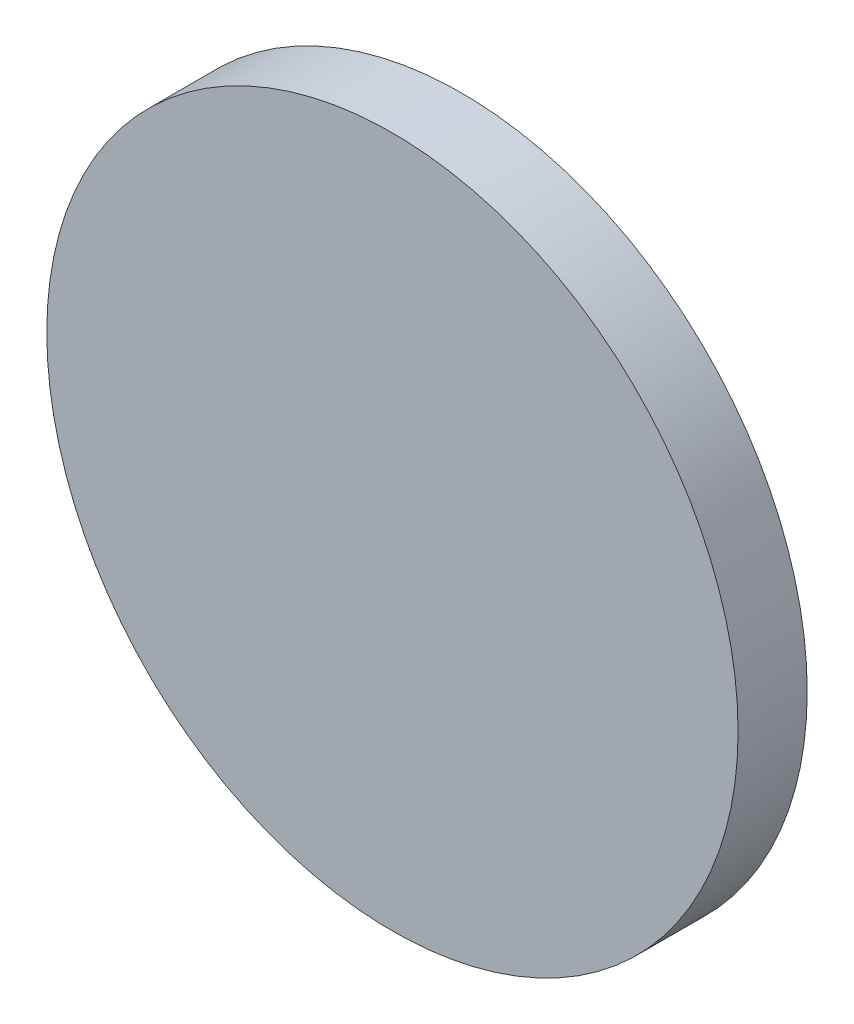
ISO-10303-21;
HEADER;
FILE_DESCRIPTION(('STEP AP214'),'2;1');
FILE_NAME('part.step','',(''),(''),'','','');
FILE_SCHEMA(('AUTOMOTIVE_DESIGN { 1 0 10303 214 1 1 1 1 }'));
ENDSEC;
DATA;
#1=APPLICATION_CONTEXT('core data for automotive mechanical design processes');
#2=APPLICATION_PROTOCOL_DEFINITION('international standard','automotive_design',2000,#1);
#3=PRODUCT_CONTEXT('',#1,'mechanical');
#4=PRODUCT('Part','Part','',(#3));
#5=PRODUCT_RELATED_PRODUCT_CATEGORY('part','',(#4));
#6=PRODUCT_DEFINITION_FORMATION('','',#4);
#7=PRODUCT_DEFINITION_CONTEXT('part definition',#1,'design');
#8=PRODUCT_DEFINITION('design','',#6,#7);
#9=PRODUCT_DEFINITION_SHAPE('','',#8);
#10=(LENGTH_UNIT() NAMED_UNIT(*) SI_UNIT(.MILLI.,.METRE.));
#11=(NAMED_UNIT(*) PLANE_ANGLE_UNIT() SI_UNIT($,.RADIAN.));
#12=(NAMED_UNIT(*) SI_UNIT($,.STERADIAN.) SOLID_ANGLE_UNIT());
#13=UNCERTAINTY_MEASURE_WITH_UNIT(LENGTH_MEASURE(1.E-05),#10,'distance_accuracy_value','');
#14=(GEOMETRIC_REPRESENTATION_CONTEXT(3) GLOBAL_UNCERTAINTY_ASSIGNED_CONTEXT((#13)) GLOBAL_UNIT_ASSIGNED_CONTEXT((#10,
#11,#12)) REPRESENTATION_CONTEXT('',''));
#15=CARTESIAN_POINT('',(0.,0.,0.));
#16=DIRECTION('',(0.,0.,1.));
#17=DIRECTION('',(1.,0.,0.));
#18=AXIS2_PLACEMENT_3D('',#15,#16,#17);
#19=CARTESIAN_POINT('',(0.,0.,10.));
#20=DIRECTION('',(0.,0.,-1.));
#21=DIRECTION('',(-1.,0.,0.));
#22=AXIS2_PLACEMENT_3D('',#19,#20,#21);
#23=CYLINDRICAL_SURFACE('',#22,50.);
#24=CARTESIAN_POINT('',(0.,0.,10.));
#25=DIRECTION('',(0.,0.,1.));
#26=DIRECTION('',(1.,0.,0.));
#27=AXIS2_PLACEMENT_3D('',#24,#25,#26);
#28=CIRCLE('',#27,50.);
#29=CARTESIAN_POINT('',(50.,0.,10.));
#30=VERTEX_POINT('',#29);
#31=EDGE_CURVE('E10',#30,#30,#28,.T.);
#32=ORIENTED_EDGE('',*,*,#31,.F.);
#33=EDGE_LOOP('',(#32));
#34=FACE_BOUND('',#33,.T.);
#35=CARTESIAN_POINT('',(0.,0.,0.));
#36=DIRECTION('',(0.,0.,1.));
#37=DIRECTION('',(1.,0.,0.));
#38=AXIS2_PLACEMENT_3D('',#35,#36,#37);
#39=CIRCLE('',#38,50.);
#40=CARTESIAN_POINT('',(50.,0.,0.));
#41=VERTEX_POINT('',#40);
#42=EDGE_CURVE('E48',#41,#41,#39,.T.);
#43=ORIENTED_EDGE('',*,*,#42,.T.);
#44=EDGE_LOOP('',(#43));
#45=FACE_BOUND('',#44,.T.);
#46=ADVANCED_FACE('F45',(#34,#45),#23,.T.);
#47=CARTESIAN_POINT('',(0.,0.,10.));
#48=DIRECTION('',(0.,0.,1.));
#49=DIRECTION('',(1.,0.,0.));
#50=AXIS2_PLACEMENT_3D('',#47,#48,#49);
#51=PLANE('',#50);
#52=ORIENTED_EDGE('',*,*,#31,.T.);
#53=EDGE_LOOP('',(#52));
#54=FACE_BOUND('',#53,.T.);
#55=ADVANCED_FACE('F61',(#54),#51,.T.);
#56=CARTESIAN_POINT('',(0.,0.,0.));
#57=DIRECTION('',(0.,0.,1.));
#58=DIRECTION('',(1.,0.,0.));
#59=AXIS2_PLACEMENT_3D('',#56,#57,#58);
#60=PLANE('',#59);
#61=ORIENTED_EDGE('',*,*,#42,.F.);
#62=EDGE_LOOP('',(#61));
#63=FACE_BOUND('',#62,.T.);
#64=ADVANCED_FACE('F59',(#63),#60,.F.);
#65=CLOSED_SHELL('',(#46,#55,#64));
#66=MANIFOLD_SOLID_BREP('B2',#65);
#67=ADVANCED_BREP_SHAPE_REPRESENTATION('',(#18,#66),#14);
#68=SHAPE_DEFINITION_REPRESENTATION(#9,#67);
ENDSEC;
END-ISO-10303-21;
